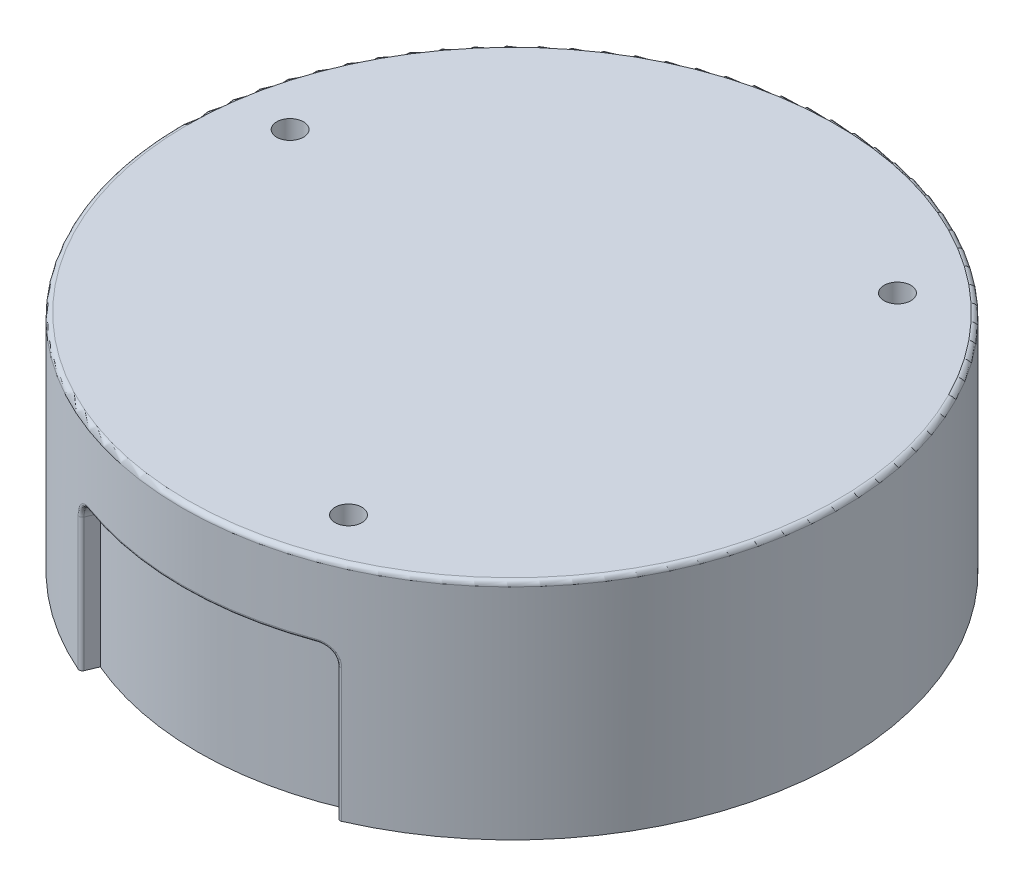
ISO-10303-21;
HEADER;
FILE_DESCRIPTION(('STEP AP214'),'2;1');
FILE_NAME('part.step','',(''),(''),'','','');
FILE_SCHEMA(('AUTOMOTIVE_DESIGN { 1 0 10303 214 1 1 1 1 }'));
ENDSEC;
DATA;
#1=APPLICATION_CONTEXT('core data for automotive mechanical design processes');
#2=APPLICATION_PROTOCOL_DEFINITION('international standard','automotive_design',2000,#1);
#3=PRODUCT_CONTEXT('',#1,'mechanical');
#4=PRODUCT('Part','Part','',(#3));
#5=PRODUCT_RELATED_PRODUCT_CATEGORY('part','',(#4));
#6=PRODUCT_DEFINITION_FORMATION('','',#4);
#7=PRODUCT_DEFINITION_CONTEXT('part definition',#1,'design');
#8=PRODUCT_DEFINITION('design','',#6,#7);
#9=PRODUCT_DEFINITION_SHAPE('','',#8);
#10=(LENGTH_UNIT() NAMED_UNIT(*) SI_UNIT(.MILLI.,.METRE.));
#11=(NAMED_UNIT(*) PLANE_ANGLE_UNIT() SI_UNIT($,.RADIAN.));
#12=(NAMED_UNIT(*) SI_UNIT($,.STERADIAN.) SOLID_ANGLE_UNIT());
#13=UNCERTAINTY_MEASURE_WITH_UNIT(LENGTH_MEASURE(1.E-05),#10,'distance_accuracy_value','');
#14=(GEOMETRIC_REPRESENTATION_CONTEXT(3) GLOBAL_UNCERTAINTY_ASSIGNED_CONTEXT((#13)) GLOBAL_UNIT_ASSIGNED_CONTEXT((#10,
#11,#12)) REPRESENTATION_CONTEXT('',''));
#15=CARTESIAN_POINT('',(0.,0.,0.));
#16=DIRECTION('',(0.,0.,1.));
#17=DIRECTION('',(1.,0.,0.));
#18=AXIS2_PLACEMENT_3D('',#15,#16,#17);
#19=CARTESIAN_POINT('',(10.3602878873447,0.,24.3908678585109));
#20=DIRECTION('',(0.920410107868333,0.,-0.390954259899803));
#21=DIRECTION('',(-0.390954259899803,0.,-0.920410107868333));
#22=AXIS2_PLACEMENT_3D('',#19,#20,#21);
#23=PLANE('',#22);
#24=DIRECTION('',(-0.390954259899803,0.,-0.920410107868333));
#25=VECTOR('',#24,1.);
#26=CARTESIAN_POINT('',(9.69553694321307,10.7,22.8258676757515));
#27=LINE('',#26,#25);
#28=CARTESIAN_POINT('',(10.2605049864771,10.7,24.155952422177));
#29=VERTEX_POINT('',#28);
#30=CARTESIAN_POINT('',(9.87159506246993,10.7,23.2403552236755));
#31=VERTEX_POINT('',#30);
#32=EDGE_CURVE('E276',#29,#31,#27,.T.);
#33=ORIENTED_EDGE('',*,*,#32,.T.);
#34=DIRECTION('',(0.,1.,0.));
#35=VECTOR('',#34,1.);
#36=CARTESIAN_POINT('',(9.87159506246992,0.,23.2403552236755));
#37=LINE('',#36,#35);
#38=CARTESIAN_POINT('',(9.87159506246993,0.,23.2403552236755));
#39=VERTEX_POINT('',#38);
#40=EDGE_CURVE('E113',#39,#31,#37,.T.);
#41=ORIENTED_EDGE('',*,*,#40,.F.);
#42=DIRECTION('',(-0.390954259899803,0.,-0.920410107868333));
#43=VECTOR('',#42,1.);
#44=CARTESIAN_POINT('',(10.3602878873447,0.,24.3908678585109));
#45=LINE('',#44,#43);
#46=CARTESIAN_POINT('',(10.2605049864771,0.,24.155952422177));
#47=VERTEX_POINT('',#46);
#48=EDGE_CURVE('E469',#47,#39,#45,.T.);
#49=ORIENTED_EDGE('',*,*,#48,.F.);
#50=DIRECTION('',(0.,-1.,0.));
#51=VECTOR('',#50,1.);
#52=CARTESIAN_POINT('',(10.2605049864772,8.81,24.155952422177));
#53=LINE('',#52,#51);
#54=EDGE_CURVE('E218',#29,#47,#53,.T.);
#55=ORIENTED_EDGE('',*,*,#54,.F.);
#56=EDGE_LOOP('',(#33,#41,#49,#55));
#57=FACE_BOUND('',#56,.T.);
#58=ADVANCED_FACE('F16',(#57),#23,.F.);
#59=CARTESIAN_POINT('',(0.,0.,0.));
#60=DIRECTION('',(0.,1.,0.));
#61=DIRECTION('',(0.,0.,1.));
#62=AXIS2_PLACEMENT_3D('',#59,#60,#61);
#63=CYLINDRICAL_SURFACE('',#62,25.25);
#64=CARTESIAN_POINT('',(0.,0.,0.));
#65=DIRECTION('',(0.,1.,0.));
#66=DIRECTION('',(0.,0.,1.));
#67=AXIS2_PLACEMENT_3D('',#64,#65,#66);
#68=CIRCLE('',#67,25.25);
#69=CARTESIAN_POINT('',(-9.87159506246993,0.,23.2403552236755));
#70=VERTEX_POINT('',#69);
#71=EDGE_CURVE('E421',#39,#70,#68,.F.);
#72=ORIENTED_EDGE('',*,*,#71,.F.);
#73=ORIENTED_EDGE('',*,*,#40,.T.);
#74=CARTESIAN_POINT('',(9.87159506246994,10.7,23.2403552236755));
#75=CARTESIAN_POINT('',(9.87159465947501,10.7365742184638,23.240354897456));
#76=CARTESIAN_POINT('',(9.87017356652791,10.7731309153013,23.2409590755204));
#77=CARTESIAN_POINT('',(9.86450308155758,10.8459827324794,23.2433666439949));
#78=CARTESIAN_POINT('',(9.86025382488589,10.882277865254,23.2451699770154));
#79=CARTESIAN_POINT('',(9.84330183011842,10.9903178302928,23.2523562154452));
#80=CARTESIAN_POINT('',(9.82639476512374,11.0613389982858,23.259515429829));
#81=CARTESIAN_POINT('',(9.78180783055577,11.1992889792857,23.2783013535141));
#82=CARTESIAN_POINT('',(9.7541227738822,11.2662158038438,23.2899302138777));
#83=CARTESIAN_POINT('',(9.68872169107569,11.3940760398283,23.3172130070401));
#84=CARTESIAN_POINT('',(9.65100742790135,11.4550105020307,23.3328662324101));
#85=CARTESIAN_POINT('',(9.56656584734999,11.5691491176348,23.3676142513268));
#86=CARTESIAN_POINT('',(9.51983961806613,11.6223542029131,23.3867086293748));
#87=CARTESIAN_POINT('',(9.4186260098988,11.71954464105,23.427653693062));
#88=CARTESIAN_POINT('',(9.36413720113449,11.7635282916064,23.4495048864264));
#89=CARTESIAN_POINT('',(9.24892202058683,11.841002479266,23.4951862555007));
#90=CARTESIAN_POINT('',(9.18819735782811,11.8744958812338,23.5190158886501));
#91=CARTESIAN_POINT('',(9.06218443772704,11.9300486799204,23.5678566380437));
#92=CARTESIAN_POINT('',(8.99689879328046,11.9521145632581,23.5928670752089));
#93=CARTESIAN_POINT('',(8.88634883270027,11.9787465539749,23.6346676616412));
#94=CARTESIAN_POINT('',(8.84183562409989,11.9867129235614,23.651357414177));
#95=CARTESIAN_POINT('',(8.75222702452152,11.9973390010008,23.6846643816598));
#96=CARTESIAN_POINT('',(8.70713255801568,12.0000062879876,23.701281666239));
#97=CARTESIAN_POINT('',(8.66196982082193,12.,23.7177734794641));
#98=B_SPLINE_CURVE_WITH_KNOTS('',3,(#74,#75,#76,#77,#78,#79,#80,#81,#82,#83,#84,#85,#86,#87,#88,
#89,#90,#91,#92,#93,#94,#95,#96,#97),.UNSPECIFIED.,.F.,.F.,(4,2,2,2,2,2,2,2,2,2,2,4),(0.,
0.109655262954233,0.2193052783544,0.438244651488403,0.657289523609949,0.876295916907667,
1.09527588419092,1.31429624025131,1.53325673005526,1.75209279439504,1.89642291742373,
2.04054645996015),.UNSPECIFIED.);
#99=CARTESIAN_POINT('',(8.66196982082193,12.,23.7177734794641));
#100=VERTEX_POINT('',#99);
#101=EDGE_CURVE('E269',#31,#100,#98,.T.);
#102=ORIENTED_EDGE('',*,*,#101,.T.);
#103=CARTESIAN_POINT('',(0.,12.,0.));
#104=DIRECTION('',(0.,1.,0.));
#105=DIRECTION('',(0.,0.,1.));
#106=AXIS2_PLACEMENT_3D('',#103,#104,#105);
#107=CIRCLE('',#106,25.25);
#108=CARTESIAN_POINT('',(-8.66196982082193,12.,23.7177734794641));
#109=VERTEX_POINT('',#108);
#110=EDGE_CURVE('E104',#109,#100,#107,.T.);
#111=ORIENTED_EDGE('',*,*,#110,.F.);
#112=CARTESIAN_POINT('',(-8.66196982082193,12.,23.7177734794641));
#113=CARTESIAN_POINT('',(-8.69632130905831,11.9999997590658,23.7052284413656));
#114=CARTESIAN_POINT('',(-8.73062888743221,11.998459957909,23.6926138062799));
#115=CARTESIAN_POINT('',(-8.79894551916406,11.9923149945186,23.6673272950757));
#116=CARTESIAN_POINT('',(-8.83295458419925,11.9877099527373,23.6546554212259));
#117=CARTESIAN_POINT('',(-8.9341118594598,11.9693374315952,23.6167166896159));
#118=CARTESIAN_POINT('',(-9.00050362653878,11.9510124499834,23.59148524702));
#119=CARTESIAN_POINT('',(-9.12927370059942,11.9027040873087,23.5419548362682));
#120=CARTESIAN_POINT('',(-9.19164989223602,11.8727146192024,23.5176563622624));
#121=CARTESIAN_POINT('',(-9.31065145155557,11.8019260784284,23.4707980176747));
#122=CARTESIAN_POINT('',(-9.36727790727877,11.7611290562006,23.4482378183492));
#123=CARTESIAN_POINT('',(-9.47318738181117,11.6699132505801,23.4056506828342));
#124=CARTESIAN_POINT('',(-9.52247554295646,11.6195012619551,23.3856219741946));
#125=CARTESIAN_POINT('',(-9.61243011094576,11.5104530024704,23.3487913164371));
#126=CARTESIAN_POINT('',(-9.65309478437685,11.4518150820391,23.3319900161263));
#127=CARTESIAN_POINT('',(-9.72471128826624,11.3279639784649,23.3022316651372));
#128=CARTESIAN_POINT('',(-9.75565827559008,11.2627475380204,23.2892765314997));
#129=CARTESIAN_POINT('',(-9.80697354507438,11.1276221384701,23.2677147408428));
#130=CARTESIAN_POINT('',(-9.82734795471988,11.0577159239801,23.2591055651417));
#131=CARTESIAN_POINT('',(-9.85195080281438,10.9394903679492,23.2486919605688));
#132=CARTESIAN_POINT('',(-9.85931348661692,10.8919114810411,23.2455691812536));
#133=CARTESIAN_POINT('',(-9.86913473519708,10.7962283551877,23.2414002934373));
#134=CARTESIAN_POINT('',(-9.87160019809718,10.7481249513037,23.2403512639058));
#135=CARTESIAN_POINT('',(-9.87159506246994,10.7,23.2403552236755));
#136=B_SPLINE_CURVE_WITH_KNOTS('',3,(#112,#113,#114,#115,#116,#117,#118,#119,#120,#121,#122,
#123,#124,#125,#126,#127,#128,#129,#130,#131,#132,#133,#134,#135),.UNSPECIFIED.,.F.,.F.,(4,2,2,
2,2,2,2,2,2,2,2,4),(0.,0.1096444630781,0.219284617798375,0.438207080710415,0.657243940625049,
0.876239273968339,1.09508041585948,1.31396550554285,1.53295951143698,1.75182645414098,
1.89628848010972,2.04054687519506),.UNSPECIFIED.);
#137=CARTESIAN_POINT('',(-9.87159506246994,10.7,23.2403552236755));
#138=VERTEX_POINT('',#137);
#139=EDGE_CURVE('E23',#109,#138,#136,.T.);
#140=ORIENTED_EDGE('',*,*,#139,.T.);
#141=DIRECTION('',(0.,1.,0.));
#142=VECTOR('',#141,1.);
#143=CARTESIAN_POINT('',(-9.87159506246993,0.,23.2403552236755));
#144=LINE('',#143,#142);
#145=EDGE_CURVE('E101',#138,#70,#144,.F.);
#146=ORIENTED_EDGE('',*,*,#145,.T.);
#147=EDGE_LOOP('',(#72,#73,#102,#111,#140,#146));
#148=FACE_BOUND('',#147,.T.);
#149=ADVANCED_FACE('F100',(#148),#63,.T.);
#150=CARTESIAN_POINT('',(-21.6657705662686,-59.0843693624071,-3.82025990867248));
#151=DIRECTION('',(0.,1.,0.));
#152=DIRECTION('',(0.,0.,1.));
#153=AXIS2_PLACEMENT_3D('',#150,#151,#152);
#154=CYLINDRICAL_SURFACE('',#153,1.078);
#155=CARTESIAN_POINT('',(-21.6657705662686,18.,-3.82025990867248));
#156=DIRECTION('',(0.,1.,0.));
#157=DIRECTION('',(0.,0.,1.));
#158=AXIS2_PLACEMENT_3D('',#155,#156,#157);
#159=CIRCLE('',#158,1.078);
#160=CARTESIAN_POINT('',(-21.6657705662686,18.,-2.74225990867248));
#161=VERTEX_POINT('',#160);
#162=EDGE_CURVE('E439',#161,#161,#159,.F.);
#163=ORIENTED_EDGE('',*,*,#162,.F.);
#164=EDGE_LOOP('',(#163));
#165=FACE_BOUND('',#164,.T.);
#166=CARTESIAN_POINT('',(-21.6657705662686,0.,-3.82025990867248));
#167=DIRECTION('',(0.,1.,0.));
#168=DIRECTION('',(0.,0.,1.));
#169=AXIS2_PLACEMENT_3D('',#166,#167,#168);
#170=CIRCLE('',#169,1.078);
#171=CARTESIAN_POINT('',(-21.6657705662686,0.,-2.74225990867248));
#172=VERTEX_POINT('',#171);
#173=EDGE_CURVE('E420',#172,#172,#170,.T.);
#174=ORIENTED_EDGE('',*,*,#173,.F.);
#175=EDGE_LOOP('',(#174));
#176=FACE_BOUND('',#175,.T.);
#177=ADVANCED_FACE('F261',(#165,#176),#154,.F.);
#178=CARTESIAN_POINT('',(14.1413274131039,-59.0843693624071,-16.8529777486175));
#179=DIRECTION('',(0.,1.,0.));
#180=DIRECTION('',(0.,0.,1.));
#181=AXIS2_PLACEMENT_3D('',#178,#179,#180);
#182=CYLINDRICAL_SURFACE('',#181,1.078);
#183=CARTESIAN_POINT('',(14.1413274131039,18.,-16.8529777486175));
#184=DIRECTION('',(0.,1.,0.));
#185=DIRECTION('',(0.,0.,1.));
#186=AXIS2_PLACEMENT_3D('',#183,#184,#185);
#187=CIRCLE('',#186,1.078);
#188=CARTESIAN_POINT('',(14.1413274131039,18.,-15.7749777486175));
#189=VERTEX_POINT('',#188);
#190=EDGE_CURVE('E434',#189,#189,#187,.F.);
#191=ORIENTED_EDGE('',*,*,#190,.F.);
#192=EDGE_LOOP('',(#191));
#193=FACE_BOUND('',#192,.T.);
#194=CARTESIAN_POINT('',(14.1413274131039,0.,-16.8529777486175));
#195=DIRECTION('',(0.,1.,0.));
#196=DIRECTION('',(0.,0.,1.));
#197=AXIS2_PLACEMENT_3D('',#194,#195,#196);
#198=CIRCLE('',#197,1.078);
#199=CARTESIAN_POINT('',(14.1413274131039,0.,-15.7749777486175));
#200=VERTEX_POINT('',#199);
#201=EDGE_CURVE('E424',#200,#200,#198,.T.);
#202=ORIENTED_EDGE('',*,*,#201,.F.);
#203=EDGE_LOOP('',(#202));
#204=FACE_BOUND('',#203,.T.);
#205=ADVANCED_FACE('F257',(#193,#204),#182,.F.);
#206=CARTESIAN_POINT('',(7.52444315316472,-59.0843693624071,20.67323765729));
#207=DIRECTION('',(0.,1.,0.));
#208=DIRECTION('',(0.,0.,1.));
#209=AXIS2_PLACEMENT_3D('',#206,#207,#208);
#210=CYLINDRICAL_SURFACE('',#209,1.078);
#211=CARTESIAN_POINT('',(7.52444315316472,18.,20.67323765729));
#212=DIRECTION('',(0.,1.,0.));
#213=DIRECTION('',(0.,0.,1.));
#214=AXIS2_PLACEMENT_3D('',#211,#212,#213);
#215=CIRCLE('',#214,1.078);
#216=CARTESIAN_POINT('',(7.52444315316472,18.,21.75123765729));
#217=VERTEX_POINT('',#216);
#218=EDGE_CURVE('E227',#217,#217,#215,.F.);
#219=ORIENTED_EDGE('',*,*,#218,.F.);
#220=EDGE_LOOP('',(#219));
#221=FACE_BOUND('',#220,.T.);
#222=CARTESIAN_POINT('',(7.52444315316472,0.,20.67323765729));
#223=DIRECTION('',(0.,1.,0.));
#224=DIRECTION('',(0.,0.,1.));
#225=AXIS2_PLACEMENT_3D('',#222,#223,#224);
#226=CIRCLE('',#225,1.078);
#227=CARTESIAN_POINT('',(7.52444315316472,0.,21.75123765729));
#228=VERTEX_POINT('',#227);
#229=EDGE_CURVE('E455',#228,#228,#226,.T.);
#230=ORIENTED_EDGE('',*,*,#229,.F.);
#231=EDGE_LOOP('',(#230));
#232=FACE_BOUND('',#231,.T.);
#233=ADVANCED_FACE('F254',(#221,#232),#210,.F.);
#234=CARTESIAN_POINT('',(-9.87159506246993,0.,23.2403552236755));
#235=DIRECTION('',(-0.920410107868334,0.,-0.390954259899803));
#236=DIRECTION('',(-0.390954259899803,0.,0.920410107868334));
#237=AXIS2_PLACEMENT_3D('',#234,#235,#236);
#238=PLANE('',#237);
#239=DIRECTION('',(-0.39095425989982,0.,0.920410107868326));
#240=VECTOR('',#239,1.);
#241=CARTESIAN_POINT('',(-9.87159506246993,0.,23.2403552236755));
#242=LINE('',#241,#240);
#243=CARTESIAN_POINT('',(-10.2605049864771,0.,24.155952422177));
#244=VERTEX_POINT('',#243);
#245=EDGE_CURVE('E111',#70,#244,#242,.T.);
#246=ORIENTED_EDGE('',*,*,#245,.F.);
#247=ORIENTED_EDGE('',*,*,#145,.F.);
#248=DIRECTION('',(-0.390954259899803,0.,0.920410107868334));
#249=VECTOR('',#248,1.);
#250=CARTESIAN_POINT('',(-9.45119053077569,10.7,22.2506113583338));
#251=LINE('',#250,#249);
#252=CARTESIAN_POINT('',(-10.2605049864771,10.7,24.155952422177));
#253=VERTEX_POINT('',#252);
#254=EDGE_CURVE('E106',#138,#253,#251,.T.);
#255=ORIENTED_EDGE('',*,*,#254,.T.);
#256=DIRECTION('',(0.,1.,0.));
#257=VECTOR('',#256,1.);
#258=CARTESIAN_POINT('',(-10.2605049864772,8.81,24.155952422177));
#259=LINE('',#258,#257);
#260=EDGE_CURVE('E185',#244,#253,#259,.T.);
#261=ORIENTED_EDGE('',*,*,#260,.F.);
#262=EDGE_LOOP('',(#246,#247,#255,#261));
#263=FACE_BOUND('',#262,.T.);
#264=ADVANCED_FACE('F108',(#263),#238,.F.);
#265=CARTESIAN_POINT('',(-8.25465739054686,10.7,22.7588518962035));
#266=DIRECTION('',(-0.390954259899803,0.,0.920410107868334));
#267=DIRECTION('',(0.920410107868334,0.,0.390954259899803));
#268=AXIS2_PLACEMENT_3D('',#265,#266,#267);
#269=CYLINDRICAL_SURFACE('',#268,1.3);
#270=ORIENTED_EDGE('',*,*,#254,.F.);
#271=ORIENTED_EDGE('',*,*,#139,.F.);
#272=DIRECTION('',(0.390954259883478,0.,-0.920410107875268));
#273=VECTOR('',#272,1.);
#274=CARTESIAN_POINT('',(-9.05185771374967,12.,24.6356730764549));
#275=LINE('',#274,#273);
#276=CARTESIAN_POINT('',(-9.05185771373845,12.,24.6356730764594));
#277=VERTEX_POINT('',#276);
#278=EDGE_CURVE('E120',#277,#109,#275,.T.);
#279=ORIENTED_EDGE('',*,*,#278,.F.);
#280=CARTESIAN_POINT('',(-10.2605049864771,10.7,24.155952422177));
#281=CARTESIAN_POINT('',(-10.2605049864771,11.089026745072,24.155952422177));
#282=CARTESIAN_POINT('',(-9.96237386238926,11.7623106599891,24.2902581209818));
#283=CARTESIAN_POINT('',(-9.32683009977453,12.0000000000079,24.5376448116921));
#284=CARTESIAN_POINT('',(-9.05185771373338,12.,24.6356730764619));
#285=B_SPLINE_CURVE_WITH_KNOTS('',3,(#280,#281,#282,#283,#284),.UNSPECIFIED.,.F.,.F.,(4,1,4),
(0.,0.139510975809667,0.244144207666917),.UNSPECIFIED.);
#286=EDGE_CURVE('E117',#277,#253,#285,.F.);
#287=ORIENTED_EDGE('',*,*,#286,.T.);
#288=EDGE_LOOP('',(#270,#271,#279,#287));
#289=FACE_BOUND('',#288,.T.);
#290=ADVANCED_FACE('F115',(#289),#269,.F.);
#291=CARTESIAN_POINT('',(0.,12.,25.0967926163714));
#292=DIRECTION('',(0.,-1.,0.));
#293=DIRECTION('',(0.,0.,-1.));
#294=AXIS2_PLACEMENT_3D('',#291,#292,#293);
#295=PLANE('',#294);
#296=ORIENTED_EDGE('',*,*,#110,.T.);
#297=DIRECTION('',(-0.390954259899803,0.,-0.920410107868333));
#298=VECTOR('',#297,1.);
#299=CARTESIAN_POINT('',(8.49900380298423,12.,23.3341082136212));
#300=LINE('',#299,#298);
#301=CARTESIAN_POINT('',(9.05185771376669,12.,24.6356730764497));
#302=VERTEX_POINT('',#301);
#303=EDGE_CURVE('E275',#100,#302,#300,.F.);
#304=ORIENTED_EDGE('',*,*,#303,.T.);
#305=CARTESIAN_POINT('',(0.,12.,0.));
#306=DIRECTION('',(0.,1.,0.));
#307=DIRECTION('',(-0.344885228748267,0.,0.938644863082548));
#308=AXIS2_PLACEMENT_3D('',#305,#306,#307);
#309=CIRCLE('',#308,26.2459999999987);
#310=EDGE_CURVE('E232',#277,#302,#309,.T.);
#311=ORIENTED_EDGE('',*,*,#310,.F.);
#312=ORIENTED_EDGE('',*,*,#278,.T.);
#313=EDGE_LOOP('',(#296,#304,#311,#312));
#314=FACE_BOUND('',#313,.T.);
#315=ADVANCED_FACE('F238',(#314),#295,.T.);
#316=CARTESIAN_POINT('',(8.49900380298424,10.7,23.3341082136212));
#317=DIRECTION('',(-0.390954259899803,0.,-0.920410107868333));
#318=DIRECTION('',(-0.920410107868333,0.,0.390954259899803));
#319=AXIS2_PLACEMENT_3D('',#316,#317,#318);
#320=CYLINDRICAL_SURFACE('',#319,1.3);
#321=ORIENTED_EDGE('',*,*,#303,.F.);
#322=ORIENTED_EDGE('',*,*,#101,.F.);
#323=ORIENTED_EDGE('',*,*,#32,.F.);
#324=CARTESIAN_POINT('',(9.05185771376679,12.,24.6356730764499));
#325=CARTESIAN_POINT('',(9.4184874610767,12.,24.5049687593386));
#326=CARTESIAN_POINT('',(10.0435891544971,11.673524348739,24.254087752808));
#327=CARTESIAN_POINT('',(10.2605049864771,10.9917699786298,24.155952422177));
#328=CARTESIAN_POINT('',(10.2605049864771,10.7,24.155952422177));
#329=B_SPLINE_CURVE_WITH_KNOTS('',3,(#324,#325,#326,#327,#328),.UNSPECIFIED.,.F.,.F.,(4,1,4),
(0.,0.139510937474003,0.244144140579505),.UNSPECIFIED.);
#330=EDGE_CURVE('E296',#29,#302,#329,.F.);
#331=ORIENTED_EDGE('',*,*,#330,.T.);
#332=EDGE_LOOP('',(#321,#322,#323,#331));
#333=FACE_BOUND('',#332,.T.);
#334=ADVANCED_FACE('F246',(#333),#320,.F.);
#335=CARTESIAN_POINT('',(0.,18.,0.));
#336=DIRECTION('',(0.,1.,0.));
#337=DIRECTION('',(0.,0.,1.));
#338=AXIS2_PLACEMENT_3D('',#335,#336,#337);
#339=PLANE('',#338);
#340=ORIENTED_EDGE('',*,*,#218,.T.);
#341=EDGE_LOOP('',(#340));
#342=FACE_BOUND('',#341,.T.);
#343=ORIENTED_EDGE('',*,*,#190,.T.);
#344=EDGE_LOOP('',(#343));
#345=FACE_BOUND('',#344,.T.);
#346=ORIENTED_EDGE('',*,*,#162,.T.);
#347=EDGE_LOOP('',(#346));
#348=FACE_BOUND('',#347,.T.);
#349=CARTESIAN_POINT('',(0.,18.,0.));
#350=DIRECTION('',(0.,-1.,0.));
#351=DIRECTION('',(-1.,0.,0.));
#352=AXIS2_PLACEMENT_3D('',#349,#350,#351);
#353=CIRCLE('',#352,26.12);
#354=CARTESIAN_POINT('',(-26.12,18.,0.));
#355=VERTEX_POINT('',#354);
#356=EDGE_CURVE('E375',#355,#355,#353,.T.);
#357=ORIENTED_EDGE('',*,*,#356,.F.);
#358=EDGE_LOOP('',(#357));
#359=FACE_BOUND('',#358,.T.);
#360=ADVANCED_FACE('F207',(#342,#345,#348,#359),#339,.T.);
#361=CARTESIAN_POINT('',(10.4942891538757,8.81,24.0566500401624));
#362=DIRECTION('',(0.,-1.,0.));
#363=DIRECTION('',(0.,0.,-1.));
#364=AXIS2_PLACEMENT_3D('',#361,#362,#363);
#365=CYLINDRICAL_SURFACE('',#364,0.254);
#366=CARTESIAN_POINT('',(10.2605049864771,10.7,24.155952422177));
#367=CARTESIAN_POINT('',(10.2866624609964,10.7,24.217534060781));
#368=CARTESIAN_POINT('',(10.3901505231042,10.7,24.3182210948455));
#369=CARTESIAN_POINT('',(10.5345237590089,10.7,24.316214460367));
#370=CARTESIAN_POINT('',(10.5958493704833,10.7,24.2894622443155));
#371=B_SPLINE_CURVE_WITH_KNOTS('',3,(#366,#367,#368,#369,#370),.UNSPECIFIED.,.F.,.F.,(4,1,4),
(0.,0.5,1.),.UNSPECIFIED.);
#372=CARTESIAN_POINT('',(10.5958493704833,10.7,24.2894622443155));
#373=VERTEX_POINT('',#372);
#374=EDGE_CURVE('E305',#373,#29,#371,.F.);
#375=ORIENTED_EDGE('',*,*,#374,.T.);
#376=ORIENTED_EDGE('',*,*,#54,.T.);
#377=CARTESIAN_POINT('',(10.4942891538757,0.,24.0566500401624));
#378=DIRECTION('',(0.,-1.,0.));
#379=DIRECTION('',(0.,0.,-1.));
#380=AXIS2_PLACEMENT_3D('',#377,#378,#379);
#381=CIRCLE('',#380,0.254);
#382=CARTESIAN_POINT('',(10.5958493704833,0.,24.2894622443155));
#383=VERTEX_POINT('',#382);
#384=EDGE_CURVE('E226',#383,#47,#381,.T.);
#385=ORIENTED_EDGE('',*,*,#384,.F.);
#386=DIRECTION('',(0.,1.,0.));
#387=VECTOR('',#386,1.);
#388=CARTESIAN_POINT('',(10.5958493704833,8.81,24.2894622443155));
#389=LINE('',#388,#387);
#390=EDGE_CURVE('E321',#373,#383,#389,.F.);
#391=ORIENTED_EDGE('',*,*,#390,.F.);
#392=EDGE_LOOP('',(#375,#376,#385,#391));
#393=FACE_BOUND('',#392,.T.);
#394=ADVANCED_FACE('F202',(#393),#365,.T.);
#395=CARTESIAN_POINT('',(-26.5,0.,0.));
#396=DIRECTION('',(0.,-1.,0.));
#397=DIRECTION('',(0.,0.,-1.));
#398=AXIS2_PLACEMENT_3D('',#395,#396,#397);
#399=PLANE('',#398);
#400=ORIENTED_EDGE('',*,*,#229,.T.);
#401=EDGE_LOOP('',(#400));
#402=FACE_BOUND('',#401,.T.);
#403=ORIENTED_EDGE('',*,*,#201,.T.);
#404=EDGE_LOOP('',(#403));
#405=FACE_BOUND('',#404,.T.);
#406=ORIENTED_EDGE('',*,*,#173,.T.);
#407=EDGE_LOOP('',(#406));
#408=FACE_BOUND('',#407,.T.);
#409=CARTESIAN_POINT('',(-10.4942891538757,0.,24.0566500401624));
#410=DIRECTION('',(0.,1.,0.));
#411=DIRECTION('',(0.,0.,1.));
#412=AXIS2_PLACEMENT_3D('',#409,#410,#411);
#413=CIRCLE('',#412,0.254);
#414=CARTESIAN_POINT('',(-10.5958493704833,0.,24.2894622443155));
#415=VERTEX_POINT('',#414);
#416=EDGE_CURVE('E454',#415,#244,#413,.T.);
#417=ORIENTED_EDGE('',*,*,#416,.F.);
#418=CARTESIAN_POINT('',(0.,0.,0.));
#419=DIRECTION('',(0.,1.,0.));
#420=DIRECTION('',(0.,0.,1.));
#421=AXIS2_PLACEMENT_3D('',#418,#419,#420);
#422=CIRCLE('',#421,26.5);
#423=EDGE_CURVE('E366',#383,#415,#422,.T.);
#424=ORIENTED_EDGE('',*,*,#423,.F.);
#425=ORIENTED_EDGE('',*,*,#384,.T.);
#426=ORIENTED_EDGE('',*,*,#48,.T.);
#427=ORIENTED_EDGE('',*,*,#71,.T.);
#428=ORIENTED_EDGE('',*,*,#245,.T.);
#429=EDGE_LOOP('',(#417,#424,#425,#426,#427,#428));
#430=FACE_BOUND('',#429,.T.);
#431=ADVANCED_FACE('F196',(#402,#405,#408,#430),#399,.T.);
#432=CARTESIAN_POINT('',(-10.4942891538757,8.81,24.0566500401624));
#433=DIRECTION('',(0.,1.,0.));
#434=DIRECTION('',(0.,0.,1.));
#435=AXIS2_PLACEMENT_3D('',#432,#433,#434);
#436=CYLINDRICAL_SURFACE('',#435,0.254);
#437=CARTESIAN_POINT('',(-10.5958493704833,10.7,24.2894622443155));
#438=CARTESIAN_POINT('',(-10.5345237590089,10.7,24.316214460367));
#439=CARTESIAN_POINT('',(-10.3901505245079,10.7,24.3182210913196));
#440=CARTESIAN_POINT('',(-10.2866624609964,10.7,24.217534060781));
#441=CARTESIAN_POINT('',(-10.2605049864771,10.7,24.155952422177));
#442=B_SPLINE_CURVE_WITH_KNOTS('',3,(#437,#438,#439,#440,#441),.UNSPECIFIED.,.F.,.F.,(4,1,4),
(0.,0.5,1.),.UNSPECIFIED.);
#443=CARTESIAN_POINT('',(-10.5958493704833,10.7,24.2894622443155));
#444=VERTEX_POINT('',#443);
#445=EDGE_CURVE('E179',#253,#444,#442,.F.);
#446=ORIENTED_EDGE('',*,*,#445,.T.);
#447=DIRECTION('',(0.,1.,0.));
#448=VECTOR('',#447,1.);
#449=CARTESIAN_POINT('',(-10.5958493704833,8.81,24.2894622443155));
#450=LINE('',#449,#448);
#451=EDGE_CURVE('E364',#415,#444,#450,.T.);
#452=ORIENTED_EDGE('',*,*,#451,.F.);
#453=ORIENTED_EDGE('',*,*,#416,.T.);
#454=ORIENTED_EDGE('',*,*,#260,.T.);
#455=EDGE_LOOP('',(#446,#452,#453,#454));
#456=FACE_BOUND('',#455,.T.);
#457=ADVANCED_FACE('F148',(#456),#436,.T.);
#458=CARTESIAN_POINT('',(-9.13945856182907,12.254,24.8740888716875));
#459=CARTESIAN_POINT('',(-9.47000496993559,12.2540000000095,24.7526365758774));
#460=CARTESIAN_POINT('',(-10.2354745113456,11.96986981971,24.4502808900692));
#461=CARTESIAN_POINT('',(-10.5958493704833,11.1650365860322,24.2894622443155));
#462=CARTESIAN_POINT('',(-10.5958493704833,10.7,24.2894622443155));
#463=CARTESIAN_POINT('',(-9.13945856183077,12.187502955499,24.8740888716869));
#464=CARTESIAN_POINT('',(-9.45600904214186,12.1879771647858,24.7577627330635));
#465=CARTESIAN_POINT('',(-10.1898273702893,11.9157269383177,24.468789084701));
#466=CARTESIAN_POINT('',(-10.5345237590089,11.1449801176254,24.316214460367));
#467=CARTESIAN_POINT('',(-10.5345237590089,10.7,24.316214460367));
#468=CARTESIAN_POINT('',(-9.12043178797216,12.0551684220602,24.8223053157143));
#469=CARTESIAN_POINT('',(-9.40881565458398,12.0565499820794,24.7172232902123));
#470=CARTESIAN_POINT('',(-10.078144107857,11.8080346760225,24.4555527076386));
#471=CARTESIAN_POINT('',(-10.3901505245079,11.1052120971375,24.3182210913196));
#472=CARTESIAN_POINT('',(-10.3901505245079,10.7,24.3182210913196));
#473=CARTESIAN_POINT('',(-9.0747915621372,11.9999999999999,24.6980901856929));
#474=CARTESIAN_POINT('',(-9.35032173861643,12.0007548764831,24.5993580421077));
#475=CARTESIAN_POINT('',(-9.98850100176326,11.7625655597865,24.3508716843596));
#476=CARTESIAN_POINT('',(-10.2866624609964,11.0886698364059,24.217534060781));
#477=CARTESIAN_POINT('',(-10.2866624609964,10.7,24.217534060781));
#478=CARTESIAN_POINT('',(-9.05185771373338,12.,24.6356730764619));
#479=CARTESIAN_POINT('',(-9.32683009977453,12.0000000000079,24.5376448116921));
#480=CARTESIAN_POINT('',(-9.96237386238926,11.7623106599891,24.2902581209818));
#481=CARTESIAN_POINT('',(-10.2605049864771,11.089026745072,24.155952422177));
#482=CARTESIAN_POINT('',(-10.2605049864771,10.7,24.155952422177));
#483=B_SPLINE_SURFACE_WITH_KNOTS('',3,3,((#458,#459,#460,#461,#462),(#463,#464,#465,#466,#467),
(#468,#469,#470,#471,#472),(#473,#474,#475,#476,#477),(#478,#479,#480,#481,#482)),.UNSPECIFIED.,
.F.,.F.,.F.,(4,1,4),(4,1,4),(0.,0.5,1.),(0.,0.10463323185725,0.244144207666917),.UNSPECIFIED.);
#484=CARTESIAN_POINT('',(-9.13945856182908,12.254,24.8740888716875));
#485=CARTESIAN_POINT('',(-9.13945859223436,12.2498439305217,24.874088954439));
#486=CARTESIAN_POINT('',(-9.13942338282866,12.2456878685451,24.8739931279871));
#487=CARTESIAN_POINT('',(-9.1392827027135,12.2373857528966,24.8736102508545));
#488=CARTESIAN_POINT('',(-9.13917723200402,12.2332396992248,24.8733232001739));
#489=CARTESIAN_POINT('',(-9.13889624759942,12.2249675934877,24.8725584687618));
#490=CARTESIAN_POINT('',(-9.1387207339043,12.2208415414225,24.8720807880304));
#491=CARTESIAN_POINT('',(-9.13830009594083,12.2126193775541,24.870935973377));
#492=CARTESIAN_POINT('',(-9.13805497167249,12.2085232657509,24.8702688394549));
#493=CARTESIAN_POINT('',(-9.13749570052022,12.2003708506647,24.8687467186148));
#494=CARTESIAN_POINT('',(-9.13718155363631,12.1963145473816,24.8678917316966));
#495=CARTESIAN_POINT('',(-9.13648499474841,12.1882515212273,24.8659959664754));
#496=CARTESIAN_POINT('',(-9.13610258274443,12.1842447983562,24.8649551881724));
#497=CARTESIAN_POINT('',(-9.13527041469601,12.1762905855983,24.8626903470057));
#498=CARTESIAN_POINT('',(-9.13482065865157,12.1723430957117,24.861466284142));
#499=CARTESIAN_POINT('',(-9.13385488607339,12.1645168587648,24.8588378228632));
#500=CARTESIAN_POINT('',(-9.13333886953964,12.1606381117045,24.857433424448));
#501=CARTESIAN_POINT('',(-9.13224181909861,12.1529587046537,24.8544476753488));
#502=CARTESIAN_POINT('',(-9.13166078519131,12.1491580446631,24.8528663246649));
#503=CARTESIAN_POINT('',(-9.13043509976828,12.141643967874,24.8495304806502));
#504=CARTESIAN_POINT('',(-9.12979044825254,12.1379305510754,24.8477759873195));
#505=CARTESIAN_POINT('',(-9.12843908063371,12.1305999066167,24.8440980847368));
#506=CARTESIAN_POINT('',(-9.1277323645306,12.1269826789565,24.8421746754848));
#507=CARTESIAN_POINT('',(-9.12625857027822,12.1198531269929,24.8381635747215));
#508=CARTESIAN_POINT('',(-9.12549149212894,12.1163408026895,24.8360758832103));
#509=CARTESIAN_POINT('',(-9.12389882174261,12.1094295189362,24.8317412473602));
#510=CARTESIAN_POINT('',(-9.12307322950556,12.1060305594863,24.8294943030213));
#511=CARTESIAN_POINT('',(-9.12136551986772,12.0993541938311,24.8248465746016));
#512=CARTESIAN_POINT('',(-9.12048340246692,12.0960767876259,24.8224457905208));
#513=CARTESIAN_POINT('',(-9.11866476759967,12.0896514240186,24.8174961663163));
#514=CARTESIAN_POINT('',(-9.11772825013321,12.0865034666165,24.8149473261927));
#515=CARTESIAN_POINT('',(-9.11580307128724,12.0803445843208,24.8097077302818));
#516=CARTESIAN_POINT('',(-9.11481440990772,12.077333659427,24.8070169744945));
#517=CARTESIAN_POINT('',(-9.11278732500749,12.0714560957297,24.8015000295225));
#518=CARTESIAN_POINT('',(-9.11174890148678,12.0685894569262,24.7986738403379));
#519=CARTESIAN_POINT('',(-9.10962479395736,12.0630073713931,24.7928928371087));
#520=CARTESIAN_POINT('',(-9.10853910994867,12.0602919246636,24.789938023064));
#521=CARTESIAN_POINT('',(-9.10632309695116,12.0550187650277,24.7839068885206));
#522=CARTESIAN_POINT('',(-9.10519276796236,12.0524610521213,24.7808305680217));
#523=CARTESIAN_POINT('',(-9.10289018806617,12.0475095218861,24.7745638316955));
#524=CARTESIAN_POINT('',(-9.10171793715879,12.0451157045572,24.771373415868));
#525=CARTESIAN_POINT('',(-9.09933433748058,12.0404977323927,24.7648861748756));
#526=CARTESIAN_POINT('',(-9.09812298870975,12.038273577557,24.7615893497107));
#527=CARTESIAN_POINT('',(-9.0956641115499,12.0340002885624,24.754897232384));
#528=CARTESIAN_POINT('',(-9.09441658316088,12.0319511544036,24.7515019402222));
#529=CARTESIAN_POINT('',(-9.09188835216986,12.0280328433071,24.744621068458));
#530=CARTESIAN_POINT('',(-9.09060764956785,12.0261636663694,24.7411354888555));
#531=CARTESIAN_POINT('',(-9.08801615547561,12.0226097727235,24.7340824392765));
#532=CARTESIAN_POINT('',(-9.08670536398536,12.0209250560153,24.7305149693));
#533=CARTESIAN_POINT('',(-9.08405684992796,12.0177441414686,24.7233067333202));
#534=CARTESIAN_POINT('',(-9.08271912736082,12.0162479436302,24.7196659673169));
#535=CARTESIAN_POINT('',(-9.08001997384114,12.0134476712565,24.7123199102094));
#536=CARTESIAN_POINT('',(-9.07865854288862,12.0121435967211,24.7086146191053));
#537=CARTESIAN_POINT('',(-9.07591525240214,12.0097307127266,24.7011484381603));
#538=CARTESIAN_POINT('',(-9.07453339286818,12.0086219032674,24.6973875483194));
#539=CARTESIAN_POINT('',(-9.07175257424855,12.0066022201095,24.6898192302388));
#540=CARTESIAN_POINT('',(-9.07035361516289,12.0056913464109,24.686011801999));
#541=CARTESIAN_POINT('',(-9.06754196762102,12.004069731144,24.6783595794566));
#542=CARTESIAN_POINT('',(-9.06612927916482,12.0033589895758,24.674514785154));
#543=CARTESIAN_POINT('',(-9.06329357629826,12.0021393433619,24.6667970932755));
#544=CARTESIAN_POINT('',(-9.06187056188791,12.0016304387163,24.6629241956996));
#545=CARTESIAN_POINT('',(-9.05901763480855,12.0008157201341,24.6551596261427));
#546=CARTESIAN_POINT('',(-9.05758772213955,12.0005099061975,24.6512679541616));
#547=CARTESIAN_POINT('',(-9.05472444508503,12.0001020020502,24.6434752159554));
#548=CARTESIAN_POINT('',(-9.05329108069952,11.9999999118394,24.6395741497304));
#549=CARTESIAN_POINT('',(-9.05185771372681,12.,24.635673076464));
#550=B_SPLINE_CURVE_WITH_KNOTS('',3,(#484,#485,#486,#487,#488,#489,#490,#491,#492,#493,#494,
#495,#496,#497,#498,#499,#500,#501,#502,#503,#504,#505,#506,#507,#508,#509,#510,#511,#512,#513,
#514,#515,#516,#517,#518,#519,#520,#521,#522,#523,#524,#525,#526,#527,#528,#529,#530,#531,#532,
#533,#534,#535,#536,#537,#538,#539,#540,#541,#542,#543,#544,#545,#546,#547,#548,#549),
.UNSPECIFIED.,.F.,.F.,(4,2,2,2,2,2,2,2,2,2,2,2,2,2,2,2,2,2,2,2,2,2,2,2,2,2,2,2,2,2,2,2,4),(0.,
0.0124669440896587,0.024933888179317,0.0374008322689771,0.049867776358636,0.0623347204482945,
0.0748016645379521,0.0872686086276109,0.0997355527172721,0.112202496806929,0.124669440896588,
0.137136384986248,0.149603329075904,0.162070273165567,0.174537217255222,0.187004161344881,
0.199471105434542,0.211938049524198,0.22440499361386,0.236871937703519,0.249338881793178,
0.261805825882836,0.274272769972496,0.286739714062155,0.299206658151812,0.311673602241468,
0.324140546331131,0.33660749042079,0.34907443451045,0.361541378600108,0.374008322689764,
0.386475266779424,0.398942210869083),.UNSPECIFIED.);
#551=CARTESIAN_POINT('',(-9.13945856182908,12.254,24.8740888716875));
#552=VERTEX_POINT('',#551);
#553=EDGE_CURVE('E363',#552,#277,#550,.T.);
#554=CARTESIAN_POINT('',(-9.13945856182907,12.254,24.8740888716875));
#555=CARTESIAN_POINT('',(-9.47000496993559,12.2540000000095,24.7526365758774));
#556=CARTESIAN_POINT('',(-10.2354745113456,11.96986981971,24.4502808900692));
#557=CARTESIAN_POINT('',(-10.5958493704833,11.1650365860322,24.2894622443155));
#558=CARTESIAN_POINT('',(-10.5958493704833,10.7,24.2894622443155));
#559=B_SPLINE_CURVE_WITH_KNOTS('',3,(#554,#555,#556,#557,#558),.UNSPECIFIED.,.F.,.F.,(4,1,4),
(0.,0.10463323185725,0.244144207666917),.UNSPECIFIED.);
#560=EDGE_CURVE('E361',#444,#552,#559,.F.);
#561=ORIENTED_EDGE('',*,*,#286,.F.);
#562=ORIENTED_EDGE('',*,*,#553,.F.);
#563=ORIENTED_EDGE('',*,*,#560,.F.);
#564=ORIENTED_EDGE('',*,*,#445,.F.);
#565=EDGE_LOOP('',(#561,#562,#563,#564));
#566=FACE_BOUND('',#565,.T.);
#567=ADVANCED_FACE('F136',(#566),#483,.F.);
#568=CARTESIAN_POINT('',(0.,12.254,0.));
#569=DIRECTION('',(0.,1.,0.));
#570=DIRECTION('',(0.,0.,1.));
#571=AXIS2_PLACEMENT_3D('',#568,#569,#570);
#572=TOROIDAL_SURFACE('',#571,26.246,0.254);
#573=ORIENTED_EDGE('',*,*,#553,.T.);
#574=ORIENTED_EDGE('',*,*,#310,.T.);
#575=CARTESIAN_POINT('',(9.05185771376656,12.,24.6356730764494));
#576=CARTESIAN_POINT('',(9.05329108073927,11.9999999118394,24.6395741497158));
#577=CARTESIAN_POINT('',(9.05472444512479,12.0001020020502,24.6434752159408));
#578=CARTESIAN_POINT('',(9.05758772217932,12.0005099061975,24.651267954147));
#579=CARTESIAN_POINT('',(9.05901763484833,12.0008157201341,24.6551596261281));
#580=CARTESIAN_POINT('',(9.0618705619277,12.0016304387163,24.662924195685));
#581=CARTESIAN_POINT('',(9.06329357633806,12.0021393433619,24.6667970932609));
#582=CARTESIAN_POINT('',(9.06612927920463,12.0033589895758,24.6745147851394));
#583=CARTESIAN_POINT('',(9.06754196766084,12.004069731144,24.678359579442));
#584=CARTESIAN_POINT('',(9.07035361520272,12.0056913464109,24.6860118019844));
#585=CARTESIAN_POINT('',(9.07175257428839,12.0066022201095,24.6898192302242));
#586=CARTESIAN_POINT('',(9.07453339290802,12.0086219032674,24.6973875483048));
#587=CARTESIAN_POINT('',(9.07591525244198,12.0097307127266,24.7011484381456));
#588=CARTESIAN_POINT('',(9.07865854292849,12.0121435967211,24.7086146190906));
#589=CARTESIAN_POINT('',(9.08001997388104,12.0134476712565,24.7123199101948));
#590=CARTESIAN_POINT('',(9.08271912740072,12.0162479436302,24.7196659673023));
#591=CARTESIAN_POINT('',(9.08405684996786,12.0177441414686,24.7233067333056));
#592=CARTESIAN_POINT('',(9.08670536402525,12.0209250560153,24.7305149692854));
#593=CARTESIAN_POINT('',(9.08801615551551,12.0226097727235,24.7340824392618));
#594=CARTESIAN_POINT('',(9.09060764960778,12.0261636663694,24.7411354888408));
#595=CARTESIAN_POINT('',(9.09188835220981,12.0280328433071,24.7446210684433));
#596=CARTESIAN_POINT('',(9.09441658320084,12.0319511544036,24.7515019402075));
#597=CARTESIAN_POINT('',(9.09566411158984,12.0340002885624,24.7548972323693));
#598=CARTESIAN_POINT('',(9.09812298874969,12.038273577557,24.761589349696));
#599=CARTESIAN_POINT('',(9.09933433752054,12.0404977323927,24.764886174861));
#600=CARTESIAN_POINT('',(9.10171793719876,12.0451157045572,24.7713734158533));
#601=CARTESIAN_POINT('',(9.10289018810614,12.0475095218861,24.7745638316808));
#602=CARTESIAN_POINT('',(9.10519276800234,12.0524610521213,24.7808305680071));
#603=CARTESIAN_POINT('',(9.10632309699115,12.0550187650277,24.7839068885059));
#604=CARTESIAN_POINT('',(9.10853910998866,12.0602919246636,24.7899380230493));
#605=CARTESIAN_POINT('',(9.10962479399736,12.0630073713931,24.792892837094));
#606=CARTESIAN_POINT('',(9.11174890152679,12.0685894569262,24.7986738403232));
#607=CARTESIAN_POINT('',(9.1127873250475,12.0714560957297,24.8015000295078));
#608=CARTESIAN_POINT('',(9.11481440994774,12.077333659427,24.8070169744797));
#609=CARTESIAN_POINT('',(9.11580307132727,12.0803445843208,24.809707730267));
#610=CARTESIAN_POINT('',(9.11772825017325,12.0865034666165,24.814947326178));
#611=CARTESIAN_POINT('',(9.11866476763971,12.0896514240186,24.8174961663016));
#612=CARTESIAN_POINT('',(9.12048340250697,12.0960767876259,24.822445790506));
#613=CARTESIAN_POINT('',(9.12136551990777,12.0993541938311,24.8248465745869));
#614=CARTESIAN_POINT('',(9.12307322954562,12.1060305594863,24.8294943030066));
#615=CARTESIAN_POINT('',(9.12389882178267,12.1094295189362,24.8317412473455));
#616=CARTESIAN_POINT('',(9.12549149216901,12.1163408026895,24.8360758831956));
#617=CARTESIAN_POINT('',(9.12625857031829,12.1198531269929,24.8381635747068));
#618=CARTESIAN_POINT('',(9.12773236457069,12.1269826789565,24.84217467547));
#619=CARTESIAN_POINT('',(9.12843908067381,12.1305999066167,24.844098084722));
#620=CARTESIAN_POINT('',(9.12979044829266,12.1379305510754,24.8477759873048));
#621=CARTESIAN_POINT('',(9.13043509980838,12.141643967874,24.8495304806355));
#622=CARTESIAN_POINT('',(9.1316607852314,12.1491580446631,24.8528663246502));
#623=CARTESIAN_POINT('',(9.1322418191387,12.1529587046537,24.8544476753341));
#624=CARTESIAN_POINT('',(9.13333886957976,12.1606381117045,24.8574334244332));
#625=CARTESIAN_POINT('',(9.13385488611352,12.1645168587648,24.8588378228484));
#626=CARTESIAN_POINT('',(9.13482065869171,12.1723430957117,24.8614662841273));
#627=CARTESIAN_POINT('',(9.13527041473613,12.1762905855983,24.862690346991));
#628=CARTESIAN_POINT('',(9.13610258278455,12.1842447983562,24.8649551881577));
#629=CARTESIAN_POINT('',(9.13648499478853,12.1882515212273,24.8659959664607));
#630=CARTESIAN_POINT('',(9.13718155367643,12.1963145473816,24.8678917316819));
#631=CARTESIAN_POINT('',(9.13749570056035,12.2003708506647,24.8687467186));
#632=CARTESIAN_POINT('',(9.13805497171261,12.2085232657509,24.8702688394402));
#633=CARTESIAN_POINT('',(9.13830009598096,12.2126193775541,24.8709359733622));
#634=CARTESIAN_POINT('',(9.13872073394443,12.2208415414225,24.8720807880157));
#635=CARTESIAN_POINT('',(9.13889624763955,12.2249675934877,24.8725584687471));
#636=CARTESIAN_POINT('',(9.13917723204415,12.2332396992248,24.8733232001591));
#637=CARTESIAN_POINT('',(9.13928270275363,12.2373857528966,24.8736102508398));
#638=CARTESIAN_POINT('',(9.1394233828688,12.2456878685451,24.8739931279723));
#639=CARTESIAN_POINT('',(9.13945859227449,12.2498439305217,24.8740889544242));
#640=CARTESIAN_POINT('',(9.13945856186922,12.254,24.8740888716728));
#641=B_SPLINE_CURVE_WITH_KNOTS('',3,(#575,#576,#577,#578,#579,#580,#581,#582,#583,#584,#585,
#586,#587,#588,#589,#590,#591,#592,#593,#594,#595,#596,#597,#598,#599,#600,#601,#602,#603,#604,
#605,#606,#607,#608,#609,#610,#611,#612,#613,#614,#615,#616,#617,#618,#619,#620,#621,#622,#623,
#624,#625,#626,#627,#628,#629,#630,#631,#632,#633,#634,#635,#636,#637,#638,#639,#640),
.UNSPECIFIED.,.F.,.F.,(4,2,2,2,2,2,2,2,2,2,2,2,2,2,2,2,2,2,2,2,2,2,2,2,2,2,2,2,2,2,2,2,4),(0.,
0.012466944089656,0.0249338881793159,0.0374008322689743,0.0498677763586331,0.0623347204482923,
0.0748016645379544,0.0872686086276119,0.0997355527172701,0.112202496806931,0.124669440896589,
0.137136384986247,0.149603329075907,0.162070273165568,0.174537217255224,0.187004161344884,
0.199471105434543,0.2119380495242,0.224404993613862,0.236871937703519,0.249338881793176,
0.261805825882839,0.274272769972496,0.286739714062154,0.299206658151813,0.311673602241473,
0.324140546331131,0.336607490420791,0.34907443451045,0.361541378600108,0.374008322689767,
0.386475266779427,0.398942210869085),.UNSPECIFIED.);
#642=CARTESIAN_POINT('',(9.13945856186923,12.254,24.8740888716728));
#643=VERTEX_POINT('',#642);
#644=EDGE_CURVE('E44',#302,#643,#641,.T.);
#645=ORIENTED_EDGE('',*,*,#644,.T.);
#646=CARTESIAN_POINT('',(0.,12.254,0.));
#647=DIRECTION('',(0.,1.,0.));
#648=DIRECTION('',(0.,0.,1.));
#649=AXIS2_PLACEMENT_3D('',#646,#647,#648);
#650=CIRCLE('',#649,26.5);
#651=EDGE_CURVE('E323',#552,#643,#650,.T.);
#652=ORIENTED_EDGE('',*,*,#651,.F.);
#653=EDGE_LOOP('',(#573,#574,#645,#652));
#654=FACE_BOUND('',#653,.T.);
#655=ADVANCED_FACE('F147',(#654),#572,.T.);
#656=CARTESIAN_POINT('',(10.5958493704833,10.7,24.2894622443155));
#657=CARTESIAN_POINT('',(10.5958493704833,11.048777343685,24.2894622443155));
#658=CARTESIAN_POINT('',(10.3336163456719,11.8637360291849,24.4069045944734));
#659=CARTESIAN_POINT('',(9.58018698490495,12.254,24.7121525217565));
#660=CARTESIAN_POINT('',(9.13945856186924,12.254,24.8740888716728));
#661=CARTESIAN_POINT('',(10.5345237590089,10.7,24.316214460367));
#662=CARTESIAN_POINT('',(10.5345237590089,11.0337349965133,24.316214460367));
#663=CARTESIAN_POINT('',(10.2838598309821,11.8138918899322,24.4275479483524));
#664=CARTESIAN_POINT('',(9.5615257529723,12.1881352343623,24.7189873961273));
#665=CARTESIAN_POINT('',(9.13945856186924,12.187502955499,24.8740888716728));
#666=CARTESIAN_POINT('',(10.3901505231042,10.7,24.3182210948455));
#667=CARTESIAN_POINT('',(10.3901505231042,11.0039089893433,24.3182210948455));
#668=CARTESIAN_POINT('',(10.1635741921613,11.7148744241456,24.418302606895));
#669=CARTESIAN_POINT('',(9.50494350540182,12.0570104989471,24.6821959893256));
#670=CARTESIAN_POINT('',(9.1204317889113,12.0551684194389,24.8223053181621));
#671=CARTESIAN_POINT('',(10.2866624609964,10.7,24.217534060781));
#672=CARTESIAN_POINT('',(10.2866624609964,10.9915022972038,24.217534060781));
#673=CARTESIAN_POINT('',(10.0700440134557,11.6733114602634,24.3148043761416));
#674=CARTESIAN_POINT('',(9.4421650298604,12.0010065016903,24.5664473637402));
#675=CARTESIAN_POINT('',(9.0747915621707,12.,24.6980901856809));
#676=CARTESIAN_POINT('',(10.2605049864771,10.7,24.155952422177));
#677=CARTESIAN_POINT('',(10.2605049864771,10.9917699786298,24.155952422177));
#678=CARTESIAN_POINT('',(10.0435891544971,11.673524348739,24.254087752808));
#679=CARTESIAN_POINT('',(9.4184874610767,12.,24.5049687593386));
#680=CARTESIAN_POINT('',(9.05185771376679,12.,24.6356730764499));
#681=B_SPLINE_SURFACE_WITH_KNOTS('',3,3,((#656,#657,#658,#659,#660),(#661,#662,#663,#664,#665),
(#666,#667,#668,#669,#670),(#671,#672,#673,#674,#675),(#676,#677,#678,#679,#680)),.UNSPECIFIED.,
.F.,.F.,.F.,(4,1,4),(4,1,4),(0.,0.5,1.),(0.,0.104633203105502,0.244144140579505),.UNSPECIFIED.);
#682=CARTESIAN_POINT('',(10.5958493704833,10.7,24.2894622443155));
#683=CARTESIAN_POINT('',(10.5958493704833,11.048777343685,24.2894622443155));
#684=CARTESIAN_POINT('',(10.3336163456719,11.8637360291849,24.4069045944734));
#685=CARTESIAN_POINT('',(9.58018698490495,12.254,24.7121525217565));
#686=CARTESIAN_POINT('',(9.13945856186924,12.254,24.8740888716728));
#687=B_SPLINE_CURVE_WITH_KNOTS('',3,(#682,#683,#684,#685,#686),.UNSPECIFIED.,.F.,.F.,(4,1,4),
(0.,0.104633203105502,0.244144140579505),.UNSPECIFIED.);
#688=EDGE_CURVE('E35',#643,#373,#687,.F.);
#689=ORIENTED_EDGE('',*,*,#330,.F.);
#690=ORIENTED_EDGE('',*,*,#374,.F.);
#691=ORIENTED_EDGE('',*,*,#688,.F.);
#692=ORIENTED_EDGE('',*,*,#644,.F.);
#693=EDGE_LOOP('',(#689,#690,#691,#692));
#694=FACE_BOUND('',#693,.T.);
#695=ADVANCED_FACE('F18',(#694),#681,.F.);
#696=CARTESIAN_POINT('',(0.,17.62,0.));
#697=DIRECTION('',(0.,1.,0.));
#698=DIRECTION('',(0.,0.,1.));
#699=AXIS2_PLACEMENT_3D('',#696,#697,#698);
#700=TOROIDAL_SURFACE('',#699,26.12,0.38);
#701=ORIENTED_EDGE('',*,*,#356,.T.);
#702=EDGE_LOOP('',(#701));
#703=FACE_BOUND('',#702,.T.);
#704=CARTESIAN_POINT('',(0.,17.62,0.));
#705=DIRECTION('',(0.,1.,0.));
#706=DIRECTION('',(0.,0.,1.));
#707=AXIS2_PLACEMENT_3D('',#704,#705,#706);
#708=CIRCLE('',#707,26.5);
#709=CARTESIAN_POINT('',(0.,17.62,26.5));
#710=VERTEX_POINT('',#709);
#711=EDGE_CURVE('E11',#710,#710,#708,.F.);
#712=ORIENTED_EDGE('',*,*,#711,.F.);
#713=EDGE_LOOP('',(#712));
#714=FACE_BOUND('',#713,.T.);
#715=ADVANCED_FACE('F340',(#703,#714),#700,.T.);
#716=CARTESIAN_POINT('',(0.,8.81,0.));
#717=DIRECTION('',(0.,1.,0.));
#718=DIRECTION('',(0.,0.,1.));
#719=AXIS2_PLACEMENT_3D('',#716,#717,#718);
#720=CYLINDRICAL_SURFACE('',#719,26.5);
#721=ORIENTED_EDGE('',*,*,#711,.T.);
#722=EDGE_LOOP('',(#721));
#723=FACE_BOUND('',#722,.T.);
#724=ORIENTED_EDGE('',*,*,#651,.T.);
#725=ORIENTED_EDGE('',*,*,#688,.T.);
#726=ORIENTED_EDGE('',*,*,#390,.T.);
#727=ORIENTED_EDGE('',*,*,#423,.T.);
#728=ORIENTED_EDGE('',*,*,#451,.T.);
#729=ORIENTED_EDGE('',*,*,#560,.T.);
#730=EDGE_LOOP('',(#724,#725,#726,#727,#728,#729));
#731=FACE_BOUND('',#730,.T.);
#732=ADVANCED_FACE('F319',(#723,#731),#720,.T.);
#733=CLOSED_SHELL('',(#58,#149,#177,#205,#233,#264,#290,#315,#334,#360,#394,#431,#457,#567,#655,
#695,#715,#732));
#734=MANIFOLD_SOLID_BREP('B1',#733);
#735=ADVANCED_BREP_SHAPE_REPRESENTATION('',(#18,#734),#14);
#736=SHAPE_DEFINITION_REPRESENTATION(#9,#735);
ENDSEC;
END-ISO-10303-21;
